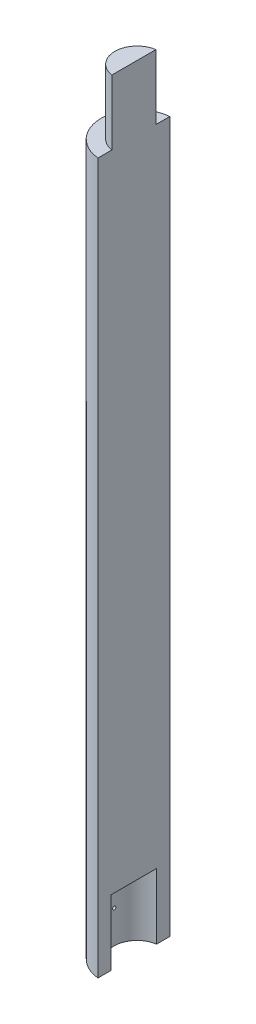
ISO-10303-21;
HEADER;
FILE_DESCRIPTION(('STEP AP214'),'2;1');
FILE_NAME('part.step','',(''),(''),'','','');
FILE_SCHEMA(('AUTOMOTIVE_DESIGN { 1 0 10303 214 1 1 1 1 }'));
ENDSEC;
DATA;
#1=APPLICATION_CONTEXT('core data for automotive mechanical design processes');
#2=APPLICATION_PROTOCOL_DEFINITION('international standard','automotive_design',2000,#1);
#3=PRODUCT_CONTEXT('',#1,'mechanical');
#4=PRODUCT('Part','Part','',(#3));
#5=PRODUCT_RELATED_PRODUCT_CATEGORY('part','',(#4));
#6=PRODUCT_DEFINITION_FORMATION('','',#4);
#7=PRODUCT_DEFINITION_CONTEXT('part definition',#1,'design');
#8=PRODUCT_DEFINITION('design','',#6,#7);
#9=PRODUCT_DEFINITION_SHAPE('','',#8);
#10=(LENGTH_UNIT() NAMED_UNIT(*) SI_UNIT(.MILLI.,.METRE.));
#11=(NAMED_UNIT(*) PLANE_ANGLE_UNIT() SI_UNIT($,.RADIAN.));
#12=(NAMED_UNIT(*) SI_UNIT($,.STERADIAN.) SOLID_ANGLE_UNIT());
#13=UNCERTAINTY_MEASURE_WITH_UNIT(LENGTH_MEASURE(1.E-05),#10,'distance_accuracy_value','');
#14=(GEOMETRIC_REPRESENTATION_CONTEXT(3) GLOBAL_UNCERTAINTY_ASSIGNED_CONTEXT((#13)) GLOBAL_UNIT_ASSIGNED_CONTEXT((#10,
#11,#12)) REPRESENTATION_CONTEXT('',''));
#15=CARTESIAN_POINT('',(0.,0.,0.));
#16=DIRECTION('',(0.,0.,1.));
#17=DIRECTION('',(1.,0.,0.));
#18=AXIS2_PLACEMENT_3D('',#15,#16,#17);
#19=CARTESIAN_POINT('',(0.,216.66667,0.));
#20=DIRECTION('',(0.,-1.,0.));
#21=DIRECTION('',(0.,0.,-1.));
#22=AXIS2_PLACEMENT_3D('',#19,#20,#21);
#23=CYLINDRICAL_SURFACE('',#22,11.);
#24=CARTESIAN_POINT('',(0.,216.66667,0.));
#25=DIRECTION('',(0.,1.,0.));
#26=DIRECTION('',(0.,0.,1.));
#27=AXIS2_PLACEMENT_3D('',#24,#25,#26);
#28=CIRCLE('',#27,11.);
#29=CARTESIAN_POINT('',(-0.999658004225934,216.66667,-10.9544823645203));
#30=VERTEX_POINT('',#29);
#31=CARTESIAN_POINT('',(-0.999658004225934,216.66667,10.9544823645203));
#32=VERTEX_POINT('',#31);
#33=EDGE_CURVE('E133',#30,#32,#28,.T.);
#34=ORIENTED_EDGE('',*,*,#33,.F.);
#35=DIRECTION('',(0.,-1.,0.));
#36=VECTOR('',#35,1.);
#37=CARTESIAN_POINT('',(-0.999658004225934,216.66667,-10.9544823645203));
#38=LINE('',#37,#36);
#39=CARTESIAN_POINT('',(-0.999658004225921,0.,-10.9544823645203));
#40=VERTEX_POINT('',#39);
#41=EDGE_CURVE('E112',#30,#40,#38,.T.);
#42=ORIENTED_EDGE('',*,*,#41,.T.);
#43=CARTESIAN_POINT('',(0.,0.,0.));
#44=DIRECTION('',(0.,1.,0.));
#45=DIRECTION('',(0.,0.,1.));
#46=AXIS2_PLACEMENT_3D('',#43,#44,#45);
#47=CIRCLE('',#46,11.);
#48=CARTESIAN_POINT('',(-0.999658004225921,0.,10.9544823645203));
#49=VERTEX_POINT('',#48);
#50=EDGE_CURVE('E126',#40,#49,#47,.T.);
#51=ORIENTED_EDGE('',*,*,#50,.T.);
#52=DIRECTION('',(0.,-1.,0.));
#53=VECTOR('',#52,1.);
#54=CARTESIAN_POINT('',(-0.999658004225934,216.66667,10.9544823645203));
#55=LINE('',#54,#53);
#56=EDGE_CURVE('E218',#49,#32,#55,.F.);
#57=ORIENTED_EDGE('',*,*,#56,.T.);
#58=EDGE_LOOP('',(#34,#42,#51,#57));
#59=FACE_BOUND('',#58,.T.);
#60=CARTESIAN_POINT('',(-10.988630487918,10.,0.5));
#61=CARTESIAN_POINT('',(-10.9886306408345,10.0280696501689,0.499998760092987));
#62=CARTESIAN_POINT('',(-10.9887391965362,10.0561592841993,0.497628346579886));
#63=CARTESIAN_POINT('',(-10.9891617738135,10.111563880896,0.488205789059037));
#64=CARTESIAN_POINT('',(-10.9894760383788,10.138877887505,0.481148108158415));
#65=CARTESIAN_POINT('',(-10.9902743615562,10.1919206063171,0.462553304914381));
#66=CARTESIAN_POINT('',(-10.9907583345468,10.2176501102539,0.4510184410909));
#67=CARTESIAN_POINT('',(-10.9918414321081,10.2668006100327,0.423800111292425));
#68=CARTESIAN_POINT('',(-10.9924405292368,10.2902221540111,0.408117633643569));
#69=CARTESIAN_POINT('',(-10.9936869605086,10.3341190963652,0.373034082386176));
#70=CARTESIAN_POINT('',(-10.9943343305035,10.3545922712605,0.353630227788665));
#71=CARTESIAN_POINT('',(-10.9956040202434,10.3919923983972,0.311660183260954));
#72=CARTESIAN_POINT('',(-10.9962263389719,10.4089192068511,0.2890938651706));
#73=CARTESIAN_POINT('',(-10.9973760532387,10.4387518304033,0.241428342400779));
#74=CARTESIAN_POINT('',(-10.9979034092951,10.4516559746461,0.216328090940845));
#75=CARTESIAN_POINT('',(-10.9988034158249,10.4730662269478,0.164314589114392));
#76=CARTESIAN_POINT('',(-10.9991760673197,10.4815723640416,0.137401350718222));
#77=CARTESIAN_POINT('',(-10.9997244342223,10.4939394381424,0.0825457433423356));
#78=CARTESIAN_POINT('',(-10.999900286859,10.4978036121525,0.0546041055311855));
#79=CARTESIAN_POINT('',(-11.000035697704,10.5007870571735,-0.00153174798859759));
#80=CARTESIAN_POINT('',(-10.9999952573869,10.499906360536,-0.0297259619738077));
#81=CARTESIAN_POINT('',(-10.9997027557701,10.4934277576983,-0.0855447193423353));
#82=CARTESIAN_POINT('',(-10.9994508508378,10.4878333370489,-0.113169668208691));
#83=CARTESIAN_POINT('',(-10.9987639785037,10.4720914921773,-0.167087931572279));
#84=CARTESIAN_POINT('',(-10.9983290104327,10.4619440513109,-0.193381241201094));
#85=CARTESIAN_POINT('',(-10.9973247459029,10.437380232839,-0.243901084134413));
#86=CARTESIAN_POINT('',(-10.9967553994074,10.4229622645625,-0.268126842985996));
#87=CARTESIAN_POINT('',(-10.9955465079848,10.390267829252,-0.313815434662402));
#88=CARTESIAN_POINT('',(-10.9949069626528,10.3719913399646,-0.335278251551225));
#89=CARTESIAN_POINT('',(-10.9936290272824,10.3320789543008,-0.374852033232831));
#90=CARTESIAN_POINT('',(-10.9929906388124,10.3104400341022,-0.392959948521761));
#91=CARTESIAN_POINT('',(-10.9917875696884,10.2644276690995,-0.425286422576582));
#92=CARTESIAN_POINT('',(-10.9912228890516,10.2400542236578,-0.439504980435741));
#93=CARTESIAN_POINT('',(-10.9902309566139,10.1892628725387,-0.463648844177506));
#94=CARTESIAN_POINT('',(-10.9898037083472,10.1628449143063,-0.473574039654291));
#95=CARTESIAN_POINT('',(-10.9891349587148,10.1087152619428,-0.488847422427505));
#96=CARTESIAN_POINT('',(-10.9888934561942,10.0810035758567,-0.494195638181199));
#97=CARTESIAN_POINT('',(-10.9886236441244,10.0250996558112,-0.500159481912648));
#98=CARTESIAN_POINT('',(-10.9885951439986,9.99690787404632,-0.500779340437574));
#99=CARTESIAN_POINT('',(-10.9887540531531,9.94082068556509,-0.497279910164288));
#100=CARTESIAN_POINT('',(-10.9889414618454,9.9129252780418,-0.493160634272868));
#101=CARTESIAN_POINT('',(-10.9895108909883,9.85823454729661,-0.480303373583729));
#102=CARTESIAN_POINT('',(-10.9898928300031,9.83143876880728,-0.471567321440484));
#103=CARTESIAN_POINT('',(-10.9908082004387,9.77969391621794,-0.44972644894136));
#104=CARTESIAN_POINT('',(-10.9913416325819,9.75474485092288,-0.436621607757152));
#105=CARTESIAN_POINT('',(-10.9925003279132,9.70738216635477,-0.406404284405434));
#106=CARTESIAN_POINT('',(-10.9931256561483,9.68497036309582,-0.389288958344303));
#107=CARTESIAN_POINT('',(-10.9943974300781,9.64333665144888,-0.351540666664192));
#108=CARTESIAN_POINT('',(-10.9950438758858,9.62411476012452,-0.33090768222958));
#109=CARTESIAN_POINT('',(-10.9962855771542,9.58939231959127,-0.286691610802186));
#110=CARTESIAN_POINT('',(-10.9968807948398,9.57389450163491,-0.263106377780339));
#111=CARTESIAN_POINT('',(-10.9979524150765,9.54707880266117,-0.213666176211488));
#112=CARTESIAN_POINT('',(-10.9984288180774,9.53576090581655,-0.18781121625925));
#113=CARTESIAN_POINT('',(-10.999208934329,9.51763110475054,-0.134575685559955));
#114=CARTESIAN_POINT('',(-10.9995127147617,9.51081744738101,-0.107195712885509));
#115=CARTESIAN_POINT('',(-10.9999136148619,9.50188379717436,-0.0516789782946119));
#116=CARTESIAN_POINT('',(-11.0000107354283,9.49976378392577,-0.0235422196697683));
#117=CARTESIAN_POINT('',(-10.9999873742469,9.50027780406042,0.0326622456774278));
#118=CARTESIAN_POINT('',(-10.9998670887664,9.50290754951113,0.0607299917982187));
#119=CARTESIAN_POINT('',(-10.9994228461976,9.51283758381306,0.116025085710192));
#120=CARTESIAN_POINT('',(-10.9990988887193,9.52013788160652,0.143252431892242));
#121=CARTESIAN_POINT('',(-10.9982837606281,9.53920095633928,0.1960948507006));
#122=CARTESIAN_POINT('',(-10.9977925882378,9.55096378071693,0.221709906184275));
#123=CARTESIAN_POINT('',(-10.9966982973532,9.57861717308637,0.270601665911247));
#124=CARTESIAN_POINT('',(-10.996095182461,9.59450760827093,0.293878445355933));
#125=CARTESIAN_POINT('',(-10.9948442968689,9.62998018528402,0.337454128026967));
#126=CARTESIAN_POINT('',(-10.994196491082,9.64956524920548,0.357750651408521));
#127=CARTESIAN_POINT('',(-10.9929294444368,9.69187047620608,0.394773830732596));
#128=CARTESIAN_POINT('',(-10.992310210658,9.71459141076246,0.411499605623786));
#129=CARTESIAN_POINT('',(-10.9911697864303,9.76253883284617,0.440912981719156));
#130=CARTESIAN_POINT('',(-10.9906486821896,9.78776749399876,0.453597038922565));
#131=CARTESIAN_POINT('',(-10.9897646943046,9.83997963401266,0.474534310852451));
#132=CARTESIAN_POINT('',(-10.9894016233843,9.86696099202063,0.482792772787898));
#133=CARTESIAN_POINT('',(-10.9889710270666,9.91175896525654,0.492472130814624));
#134=CARTESIAN_POINT('',(-10.988843885798,9.92928524283079,0.495291491839067));
#135=CARTESIAN_POINT('',(-10.9886735679456,9.96453835458079,0.499055817471611));
#136=CARTESIAN_POINT('',(-10.9886303913031,9.9822651886162,0.500000783391203));
#137=CARTESIAN_POINT('',(-10.988630487918,10.,0.5));
#138=B_SPLINE_CURVE_WITH_KNOTS('',3,(#60,#61,#62,#63,#64,#65,#66,#67,#68,#69,#70,#71,#72,#73,
#74,#75,#76,#77,#78,#79,#80,#81,#82,#83,#84,#85,#86,#87,#88,#89,#90,#91,#92,#93,#94,#95,#96,#97,
#98,#99,#100,#101,#102,#103,#104,#105,#106,#107,#108,#109,#110,#111,#112,#113,#114,#115,#116,
#117,#118,#119,#120,#121,#122,#123,#124,#125,#126,#127,#128,#129,#130,#131,#132,#133,#134,#135,
#136,#137),.UNSPECIFIED.,.T.,.F.,(4,2,2,2,2,2,2,2,2,2,2,2,2,2,2,2,2,2,2,2,2,2,2,2,2,2,2,2,2,2,2,
2,2,2,2,2,2,2,4),(0.,0.0841442128600546,0.168387999329543,0.252589344042456,0.336770642644111,
0.421015096889708,0.505262966164764,0.589545782188115,0.673828041783952,0.758051494234729,
0.842274372434036,0.92643502684802,1.01059598892765,1.09478833849561,1.17898117364354,
1.26325016603962,1.34751917808144,1.43179035701149,1.51606101198364,1.60025625961515,
1.68445127794573,1.76861107881589,1.8527712809261,1.93699134384521,2.02121185726384,
2.10549395115199,2.18977572590329,2.27402467700673,2.35827326173226,2.44244582750093,
2.52661855442661,2.61079217616513,2.69496308992517,2.77920085595452,2.86345938296345,
2.94779159046717,3.03202358697711,3.085187156144,3.13835068811301),.UNSPECIFIED.);
#139=CARTESIAN_POINT('',(-10.988630487918,10.,0.5));
#140=VERTEX_POINT('',#139);
#141=EDGE_CURVE('E175',#140,#140,#138,.T.);
#142=ORIENTED_EDGE('',*,*,#141,.F.);
#143=EDGE_LOOP('',(#142));
#144=FACE_BOUND('',#143,.T.);
#145=ADVANCED_FACE('F45',(#59,#144),#23,.T.);
#146=CARTESIAN_POINT('',(0.,20.,0.));
#147=DIRECTION('',(0.,-1.,0.));
#148=DIRECTION('',(0.,0.,-1.));
#149=AXIS2_PLACEMENT_3D('',#146,#147,#148);
#150=CYLINDRICAL_SURFACE('',#149,7.);
#151=DIRECTION('',(0.,-1.,0.));
#152=VECTOR('',#151,1.);
#153=CARTESIAN_POINT('',(-0.999658004225923,20.,-6.92825258449683));
#154=LINE('',#153,#152);
#155=CARTESIAN_POINT('',(-0.999658004225923,20.,-6.92825258449683));
#156=VERTEX_POINT('',#155);
#157=CARTESIAN_POINT('',(-0.999658004225921,0.,-6.92825258449683));
#158=VERTEX_POINT('',#157);
#159=EDGE_CURVE('E215',#156,#158,#154,.T.);
#160=ORIENTED_EDGE('',*,*,#159,.F.);
#161=CARTESIAN_POINT('',(0.,20.,0.));
#162=DIRECTION('',(0.,1.,0.));
#163=DIRECTION('',(0.,0.,1.));
#164=AXIS2_PLACEMENT_3D('',#161,#162,#163);
#165=CIRCLE('',#164,7.);
#166=CARTESIAN_POINT('',(-0.999658004225923,20.,6.92825258449683));
#167=VERTEX_POINT('',#166);
#168=EDGE_CURVE('E178',#156,#167,#165,.T.);
#169=ORIENTED_EDGE('',*,*,#168,.T.);
#170=DIRECTION('',(0.,-1.,0.));
#171=VECTOR('',#170,1.);
#172=CARTESIAN_POINT('',(-0.999658004225923,20.,6.92825258449683));
#173=LINE('',#172,#171);
#174=CARTESIAN_POINT('',(-0.999658004225921,0.,6.92825258449683));
#175=VERTEX_POINT('',#174);
#176=EDGE_CURVE('E61',#175,#167,#173,.F.);
#177=ORIENTED_EDGE('',*,*,#176,.F.);
#178=CARTESIAN_POINT('',(0.,0.,0.));
#179=DIRECTION('',(0.,1.,0.));
#180=DIRECTION('',(0.,0.,1.));
#181=AXIS2_PLACEMENT_3D('',#178,#179,#180);
#182=CIRCLE('',#181,7.);
#183=EDGE_CURVE('E54',#175,#158,#182,.F.);
#184=ORIENTED_EDGE('',*,*,#183,.T.);
#185=EDGE_LOOP('',(#160,#169,#177,#184));
#186=FACE_BOUND('',#185,.T.);
#187=CARTESIAN_POINT('',(-6.98212002188447,10.,0.5));
#188=CARTESIAN_POINT('',(-6.98212026019684,10.0280467568763,0.499998769244178));
#189=CARTESIAN_POINT('',(-6.98229083321164,10.0561129379612,0.497632204535513));
#190=CARTESIAN_POINT('',(-6.98295474085973,10.111469702785,0.488225828593486));
#191=CARTESIAN_POINT('',(-6.98344844724258,10.1387593553861,0.481180634683073));
#192=CARTESIAN_POINT('',(-6.98470241732412,10.1917532394701,0.462620946811939));
#193=CARTESIAN_POINT('',(-6.98546253619947,10.217458323424,0.451108880704623));
#194=CARTESIAN_POINT('',(-6.98716350167581,10.266564810098,0.42394632109158));
#195=CARTESIAN_POINT('',(-6.98810430796363,10.2899667249199,0.40829675041145));
#196=CARTESIAN_POINT('',(-6.99006267981786,10.3338540367072,0.373270687165762));
#197=CARTESIAN_POINT('',(-6.99108037313231,10.3543344089305,0.353887905249338));
#198=CARTESIAN_POINT('',(-6.99307666982089,10.3917541926016,0.311958772798071));
#199=CARTESIAN_POINT('',(-6.99405527153302,10.4086934536265,0.289412287940214));
#200=CARTESIAN_POINT('',(-6.99586427570959,10.438566211619,0.241766646581247));
#201=CARTESIAN_POINT('',(-6.99669452070996,10.4514954629885,0.216664821695315));
#202=CARTESIAN_POINT('',(-6.9981119033184,10.472954019596,0.164639720829318));
#203=CARTESIAN_POINT('',(-6.99869904417823,10.4814833836872,0.137716469218328));
#204=CARTESIAN_POINT('',(-6.99956317551645,10.4938858643815,0.0828619346968116));
#205=CARTESIAN_POINT('',(-6.99984069832454,10.4977669736276,0.054932467421988));
#206=CARTESIAN_POINT('',(-7.00005612169472,10.5007874671409,-0.00118278070601036));
#207=CARTESIAN_POINT('',(-6.99999402706535,10.4999269185439,-0.0293685579245249));
#208=CARTESIAN_POINT('',(-6.99953765415375,10.4934950936711,-0.0851421760802396));
#209=CARTESIAN_POINT('',(-6.99914398205092,10.4879324136158,-0.112731013983813));
#210=CARTESIAN_POINT('',(-6.99806945593314,10.4722675803337,-0.166582379213727));
#211=CARTESIAN_POINT('',(-6.99738859980816,10.4621653937534,-0.192844896793534));
#212=CARTESIAN_POINT('',(-6.99581529622793,10.4376986375456,-0.243325627021074));
#213=CARTESIAN_POINT('',(-6.99492265643054,10.4233301902953,-0.267541954044169));
#214=CARTESIAN_POINT('',(-6.99302618810151,10.3907415982159,-0.313222303766978));
#215=CARTESIAN_POINT('',(-6.99202235792308,10.3725213963366,-0.334686285692684));
#216=CARTESIAN_POINT('',(-6.99001377364571,10.3326979895382,-0.374302869122249));
#217=CARTESIAN_POINT('',(-6.98900902249019,10.311087320156,-0.392447968185296));
#218=CARTESIAN_POINT('',(-6.98711410889444,10.2651225225752,-0.42485382255042));
#219=CARTESIAN_POINT('',(-6.9862239465164,10.2407683928878,-0.439114575744563));
#220=CARTESIAN_POINT('',(-6.98465877511779,10.1900030332037,-0.463346491817702));
#221=CARTESIAN_POINT('',(-6.98398378339497,10.163591638034,-0.473317309847772));
#222=CARTESIAN_POINT('',(-6.98292565515787,10.1094637840781,-0.488680993922061));
#223=CARTESIAN_POINT('',(-6.98254251415107,10.0817473453878,-0.494073930434823));
#224=CARTESIAN_POINT('',(-6.98211214327375,10.0258616959009,-0.500119359653543));
#225=CARTESIAN_POINT('',(-6.98206417348304,9.99769362011582,-0.500782294326562));
#226=CARTESIAN_POINT('',(-6.9823076204162,9.94164669874765,-0.497376211665614));
#227=CARTESIAN_POINT('',(-6.98259903482474,9.91376785119272,-0.493307226613501));
#228=CARTESIAN_POINT('',(-6.98348773690515,9.8591204685044,-0.480561494259024));
#229=CARTESIAN_POINT('',(-6.98408470364616,9.83235080019215,-0.47188958119827));
#230=CARTESIAN_POINT('',(-6.98551697215986,9.78064664207959,-0.450189059868942));
#231=CARTESIAN_POINT('',(-6.98635227675284,9.7557121739999,-0.437160400045965));
#232=CARTESIAN_POINT('',(-6.98816889099223,9.70833832047326,-0.407089639890386));
#233=CARTESIAN_POINT('',(-6.98915045351666,9.68590337647051,-0.390040557953417));
#234=CARTESIAN_POINT('',(-6.9911481055053,9.64421021613506,-0.35242304464853));
#235=CARTESIAN_POINT('',(-6.99216419540784,9.62495204015023,-0.331854568587816));
#236=CARTESIAN_POINT('',(-6.99411858955844,9.59012366709107,-0.287737117260083));
#237=CARTESIAN_POINT('',(-6.99505674904584,9.57456023786159,-0.264182791853267));
#238=CARTESIAN_POINT('',(-6.99674749336386,9.54760950654519,-0.214789067826832));
#239=CARTESIAN_POINT('',(-6.99750007962143,9.53622217234633,-0.188949686779959));
#240=CARTESIAN_POINT('',(-6.99873420077067,9.51795858984637,-0.135743969017849));
#241=CARTESIAN_POINT('',(-6.99921599063627,9.51107809702254,-0.108379095443336));
#242=CARTESIAN_POINT('',(-6.99985525867364,9.5020096256133,-0.0528789486615824));
#243=CARTESIAN_POINT('',(-7.00001274119515,9.4998215840907,-0.0247436857922632));
#244=CARTESIAN_POINT('',(-6.99998566144827,9.5002007790722,0.031431710301488));
#245=CARTESIAN_POINT('',(-6.99980185973598,9.50275744193737,0.0594719158770192));
#246=CARTESIAN_POINT('',(-6.99911437947149,9.51253149774485,0.114723743333768));
#247=CARTESIAN_POINT('',(-6.99861070040063,9.51974889824412,0.141935363871435));
#248=CARTESIAN_POINT('',(-6.99734003711329,9.53863703700059,0.194758789707946));
#249=CARTESIAN_POINT('',(-6.99657305920753,9.55030766852392,0.220370633332701));
#250=CARTESIAN_POINT('',(-6.99486179076899,9.57776965097329,0.269272950537146));
#251=CARTESIAN_POINT('',(-6.99391750412449,9.59356091153917,0.292563475004946));
#252=CARTESIAN_POINT('',(-6.99195524198601,9.62885535141929,0.336215926305171));
#253=CARTESIAN_POINT('',(-6.99093711557054,9.64836627386057,0.356571585645878));
#254=CARTESIAN_POINT('',(-6.98894317771428,9.69053387438338,0.393726345843105));
#255=CARTESIAN_POINT('',(-6.98796737664557,9.71319131788803,0.410524578801508));
#256=CARTESIAN_POINT('',(-6.98616697590803,9.76104171541481,0.440104070755859));
#257=CARTESIAN_POINT('',(-6.98534260310901,9.78623838765043,0.452879322648844));
#258=CARTESIAN_POINT('',(-6.98394123735022,9.83840709413575,0.474002001315433));
#259=CARTESIAN_POINT('',(-6.98336395689531,9.86537702277909,0.48235457662887));
#260=CARTESIAN_POINT('',(-6.98267232186361,9.91042474111922,0.492240993453022));
#261=CARTESIAN_POINT('',(-6.98246614527858,9.92821188959728,0.495146817248094));
#262=CARTESIAN_POINT('',(-6.98218991892011,9.96399669043415,0.499026713772105));
#263=CARTESIAN_POINT('',(-6.98211986889099,9.98199434239751,0.500000790129427));
#264=CARTESIAN_POINT('',(-6.98212002188447,10.,0.5));
#265=B_SPLINE_CURVE_WITH_KNOTS('',3,(#187,#188,#189,#190,#191,#192,#193,#194,#195,#196,#197,
#198,#199,#200,#201,#202,#203,#204,#205,#206,#207,#208,#209,#210,#211,#212,#213,#214,#215,#216,
#217,#218,#219,#220,#221,#222,#223,#224,#225,#226,#227,#228,#229,#230,#231,#232,#233,#234,#235,
#236,#237,#238,#239,#240,#241,#242,#243,#244,#245,#246,#247,#248,#249,#250,#251,#252,#253,#254,
#255,#256,#257,#258,#259,#260,#261,#262,#263,#264),.UNSPECIFIED.,.T.,.F.,(4,2,2,2,2,2,2,2,2,2,2,
2,2,2,2,2,2,2,2,2,2,2,2,2,2,2,2,2,2,2,2,2,2,2,2,2,2,2,4),(0.,0.0840745348681494,
0.168245963905642,0.252371707669572,0.336478703903151,0.420728654807236,0.504982183839144,
0.589324614168667,0.673665916294283,0.757861984941225,0.842056861483251,0.926098148884886,
1.01014005377849,1.09425857977757,1.17837835178802,1.26268599047371,1.34699367491084,
1.43130813520442,1.51562129759961,1.59974827223689,1.68387467295091,1.76791289392929,
1.85195210938678,1.93613835076696,2.02032566130781,2.10466601202528,2.18900571419723,
2.27326587097592,2.35752489761365,2.44159637729523,2.52566799329151,2.60973759440808,
2.69380535213984,2.77805006119128,2.8623152996366,2.94670577250915,3.03099778728952,
3.08497265996376,3.13894743125739),.UNSPECIFIED.);
#266=CARTESIAN_POINT('',(-6.98212002188447,10.,0.5));
#267=VERTEX_POINT('',#266);
#268=EDGE_CURVE('E179',#267,#267,#265,.T.);
#269=ORIENTED_EDGE('',*,*,#268,.T.);
#270=EDGE_LOOP('',(#269));
#271=FACE_BOUND('',#270,.T.);
#272=ADVANCED_FACE('F164',(#186,#271),#150,.F.);
#273=CARTESIAN_POINT('',(0.,216.66667,0.));
#274=DIRECTION('',(0.,1.,0.));
#275=DIRECTION('',(0.,0.,1.));
#276=AXIS2_PLACEMENT_3D('',#273,#274,#275);
#277=PLANE('',#276);
#278=DIRECTION('',(0.,0.,1.));
#279=VECTOR('',#278,1.);
#280=CARTESIAN_POINT('',(-0.999658004225934,216.66667,-11.));
#281=LINE('',#280,#279);
#282=CARTESIAN_POINT('',(-0.999658004225934,216.66667,-6.72611952574343));
#283=VERTEX_POINT('',#282);
#284=EDGE_CURVE('E109',#30,#283,#281,.T.);
#285=ORIENTED_EDGE('',*,*,#284,.F.);
#286=ORIENTED_EDGE('',*,*,#33,.T.);
#287=CARTESIAN_POINT('',(-0.999658004225934,216.66667,6.72611952574343));
#288=VERTEX_POINT('',#287);
#289=EDGE_CURVE('E105',#288,#32,#281,.T.);
#290=ORIENTED_EDGE('',*,*,#289,.F.);
#291=CARTESIAN_POINT('',(0.,216.66667,0.));
#292=DIRECTION('',(0.,1.,0.));
#293=DIRECTION('',(0.,0.,1.));
#294=AXIS2_PLACEMENT_3D('',#291,#292,#293);
#295=CIRCLE('',#294,6.8);
#296=EDGE_CURVE('E100',#283,#288,#295,.T.);
#297=ORIENTED_EDGE('',*,*,#296,.F.);
#298=EDGE_LOOP('',(#285,#286,#290,#297));
#299=FACE_BOUND('',#298,.T.);
#300=ADVANCED_FACE('F120',(#299),#277,.T.);
#301=CARTESIAN_POINT('',(0.,0.,0.));
#302=DIRECTION('',(0.,1.,0.));
#303=DIRECTION('',(0.,0.,1.));
#304=AXIS2_PLACEMENT_3D('',#301,#302,#303);
#305=PLANE('',#304);
#306=ORIENTED_EDGE('',*,*,#50,.F.);
#307=DIRECTION('',(0.,0.,1.));
#308=VECTOR('',#307,1.);
#309=CARTESIAN_POINT('',(-0.999658004225921,0.,-11.));
#310=LINE('',#309,#308);
#311=EDGE_CURVE('E222',#40,#158,#310,.T.);
#312=ORIENTED_EDGE('',*,*,#311,.T.);
#313=ORIENTED_EDGE('',*,*,#183,.F.);
#314=EDGE_CURVE('E117',#175,#49,#310,.T.);
#315=ORIENTED_EDGE('',*,*,#314,.T.);
#316=EDGE_LOOP('',(#306,#312,#313,#315));
#317=FACE_BOUND('',#316,.T.);
#318=ADVANCED_FACE('F161',(#317),#305,.F.);
#319=CARTESIAN_POINT('',(0.,236.46667,0.));
#320=DIRECTION('',(0.,-1.,0.));
#321=DIRECTION('',(0.,0.,-1.));
#322=AXIS2_PLACEMENT_3D('',#319,#320,#321);
#323=CYLINDRICAL_SURFACE('',#322,6.8);
#324=CARTESIAN_POINT('',(-6.78159273327439,226.66667,-0.500000000000003));
#325=CARTESIAN_POINT('',(-6.78159297837757,226.6947144594,-0.499998770231773));
#326=CARTESIAN_POINT('',(-6.78176856677654,226.722778286839,-0.497632591546759));
#327=CARTESIAN_POINT('',(-6.78245198649018,226.778130251371,-0.488227838713539));
#328=CARTESIAN_POINT('',(-6.78296019944658,226.805417459827,-0.481183897328644));
#329=CARTESIAN_POINT('',(-6.78425099555627,226.858406442766,-0.462627731505162));
#330=CARTESIAN_POINT('',(-6.78503342856656,226.884109075812,-0.45111795186696));
#331=CARTESIAN_POINT('',(-6.78678431460583,226.933211144203,-0.423960985491659));
#332=CARTESIAN_POINT('',(-6.78775272642473,226.956611088056,-0.408314715049562));
#333=CARTESIAN_POINT('',(-6.78976866583827,227.000497428313,-0.373294420232593));
#334=CARTESIAN_POINT('',(-6.79081633232312,227.020978519599,-0.353913755066674));
#335=CARTESIAN_POINT('',(-6.79287145399055,227.058400269882,-0.311988733735704));
#336=CARTESIAN_POINT('',(-6.79387890745549,227.075340777778,-0.289444242616633));
#337=CARTESIAN_POINT('',(-6.79574135636166,227.105217562981,-0.241800601139886));
#338=CARTESIAN_POINT('',(-6.79659617984393,227.118149335811,-0.216698618778854));
#339=CARTESIAN_POINT('',(-6.79805556933641,227.139612743824,-0.164672353745901));
#340=CARTESIAN_POINT('',(-6.79866013886455,227.148144440863,-0.137748096696646));
#341=CARTESIAN_POINT('',(-6.79954993521933,227.160550477922,-0.0828936605519977));
#342=CARTESIAN_POINT('',(-6.79983574266283,227.164433286724,-0.0549654063471341));
#343=CARTESIAN_POINT('',(-6.80005777399104,227.167457495318,0.00114779135176697));
#344=CARTESIAN_POINT('',(-6.79999400308205,227.166598965722,0.0293327310167222));
#345=CARTESIAN_POINT('',(-6.79952454466821,227.160171822787,0.0851018411694216));
#346=CARTESIAN_POINT('',(-6.79911951834028,227.154612317439,0.112687067651171));
#347=CARTESIAN_POINT('',(-6.79801388751421,227.138955185032,0.166531741703012));
#348=CARTESIAN_POINT('',(-6.79731328073735,227.128857522987,0.192791179050389));
#349=CARTESIAN_POINT('',(-6.79569420149225,227.104400479208,0.243267979866799));
#350=CARTESIAN_POINT('',(-6.79477551941266,227.09003699386,0.267483348055107));
#351=CARTESIAN_POINT('',(-6.79282360632603,227.057459011694,0.313162842512627));
#352=CARTESIAN_POINT('',(-6.79179037351871,227.039244454349,0.334626925531555));
#353=CARTESIAN_POINT('',(-6.78972267451368,226.999429985177,0.374247769142871));
#354=CARTESIAN_POINT('',(-6.78868821118392,226.977822163606,0.392396582431207));
#355=CARTESIAN_POINT('',(-6.78673711523689,226.931862171376,0.424810372711896));
#356=CARTESIAN_POINT('',(-6.78582048268846,226.907509999112,0.43907534743491));
#357=CARTESIAN_POINT('',(-6.78420861400634,226.856747260943,0.463316094783634));
#358=CARTESIAN_POINT('',(-6.78351339713152,226.83033651623,0.473291494325563));
#359=CARTESIAN_POINT('',(-6.78242339907657,226.776208823244,0.488664243993162));
#360=CARTESIAN_POINT('',(-6.7820286129932,226.748491896297,0.494061668834622));
#361=CARTESIAN_POINT('',(-6.78158492474778,226.692608051427,0.500115276160827));
#362=CARTESIAN_POINT('',(-6.78153521539852,226.664442338217,0.500782523331512));
#363=CARTESIAN_POINT('',(-6.78178517593299,226.60839942571,0.497385780829759));
#364=CARTESIAN_POINT('',(-6.78208484328886,226.580522224328,0.493321825389036));
#365=CARTESIAN_POINT('',(-6.78299905331064,226.525879190008,0.480587245964444));
#366=CARTESIAN_POINT('',(-6.78361324534929,226.499112155315,0.471921751308704));
#367=CARTESIAN_POINT('',(-6.78508700233736,226.447412112612,0.450235279473719));
#368=CARTESIAN_POINT('',(-6.78594657036215,226.422479127592,0.437214247704794));
#369=CARTESIAN_POINT('',(-6.78781617977533,226.375104209245,0.407158182314458));
#370=CARTESIAN_POINT('',(-6.78882649706358,226.35266697787,0.390115754806744));
#371=CARTESIAN_POINT('',(-6.79088281220847,226.310967920048,0.352511390028029));
#372=CARTESIAN_POINT('',(-6.79192881054459,226.291706136291,0.331949405448091));
#373=CARTESIAN_POINT('',(-6.79394100886642,226.256867175691,0.287841888640223));
#374=CARTESIAN_POINT('',(-6.79490705113871,226.241297173206,0.264290681464511));
#375=CARTESIAN_POINT('',(-6.79664822050773,226.214332907777,0.214901657852376));
#376=CARTESIAN_POINT('',(-6.79742334914581,226.202938611121,0.189063859879152));
#377=CARTESIAN_POINT('',(-6.7986946168929,226.184661601532,0.135861139830734));
#378=CARTESIAN_POINT('',(-6.79919103352641,226.177774399572,0.108497766791575));
#379=CARTESIAN_POINT('',(-6.7998500618275,226.168692400326,0.0529992515100641));
#380=CARTESIAN_POINT('',(-6.80001267827624,226.16649753583,0.0248641203277486));
#381=CARTESIAN_POINT('',(-6.79998579508498,226.166863226587,-0.0313083985646522));
#382=CARTESIAN_POINT('',(-6.79979712504935,226.169412577808,-0.059345860296129));
#383=CARTESIAN_POINT('',(-6.79909051843197,226.179171036077,-0.114593381986072));
#384=CARTESIAN_POINT('',(-6.79857258132922,226.1863801505,-0.141803440635282));
#385=CARTESIAN_POINT('',(-6.79726560326606,226.205250795847,-0.194624944412667));
#386=CARTESIAN_POINT('',(-6.79647657014824,226.216912197971,-0.220236435760865));
#387=CARTESIAN_POINT('',(-6.79471583354579,226.244355010418,-0.269139744831946));
#388=CARTESIAN_POINT('',(-6.79374413388129,226.260136334581,-0.292431611050076));
#389=CARTESIAN_POINT('',(-6.79172451801548,226.295412890635,-0.336091669932223));
#390=CARTESIAN_POINT('',(-6.7906764362776,226.314916346633,-0.356453209880313));
#391=CARTESIAN_POINT('',(-6.78862356662167,226.357070065518,-0.393621074326443));
#392=CARTESIAN_POINT('',(-6.78761878930475,226.379721093277,-0.410426532172276));
#393=CARTESIAN_POINT('',(-6.78576458384905,226.42756169053,-0.440022648082056));
#394=CARTESIAN_POINT('',(-6.78491539882182,226.452755138886,-0.452807045234638));
#395=CARTESIAN_POINT('',(-6.78347155374233,226.504919460085,-0.473948321363642));
#396=CARTESIAN_POINT('',(-6.78287659844061,226.531888228904,-0.482310338964581));
#397=CARTESIAN_POINT('',(-6.78216306649953,226.576960950742,-0.492217618601718));
#398=CARTESIAN_POINT('',(-6.78195016075426,226.594774246929,-0.495132185938419));
#399=CARTESIAN_POINT('',(-6.78166491548103,226.630612359725,-0.499023770068944));
#400=CARTESIAN_POINT('',(-6.78159257567097,226.648637175909,-0.500000790751353));
#401=CARTESIAN_POINT('',(-6.78159273327439,226.66667,-0.500000000000003));
#402=B_SPLINE_CURVE_WITH_KNOTS('',3,(#324,#325,#326,#327,#328,#329,#330,#331,#332,#333,#334,
#335,#336,#337,#338,#339,#340,#341,#342,#343,#344,#345,#346,#347,#348,#349,#350,#351,#352,#353,
#354,#355,#356,#357,#358,#359,#360,#361,#362,#363,#364,#365,#366,#367,#368,#369,#370,#371,#372,
#373,#374,#375,#376,#377,#378,#379,#380,#381,#382,#383,#384,#385,#386,#387,#388,#389,#390,#391,
#392,#393,#394,#395,#396,#397,#398,#399,#400,#401),.UNSPECIFIED.,.T.,.F.,(4,2,2,2,2,2,2,2,2,2,2,
2,2,2,2,2,2,2,2,2,2,2,2,2,2,2,2,2,2,2,2,2,2,2,2,2,2,2,4),(0.,0.084067542244147,
0.168231710124494,0.25234986762154,0.33644940726993,0.420699902967313,0.50495399348977,
0.589302417128914,0.673649655006859,0.757843004383307,0.842035099863553,0.9260644486161,
1.01009444519175,1.09420553978808,1.17831795645116,1.26262943303786,1.34694095888795,
1.43125981621085,1.51557729736375,1.59969748038507,1.68381705477462,1.7678430574443,
1.85187011328479,1.93605288503218,2.02023678843055,2.10458297232425,2.18892847522237,
2.27318984236082,2.35745000258294,2.44151142487004,2.52557298016638,2.60963210383002,
2.69368946974239,2.77793475820918,2.86220055449528,2.94659691296704,3.03089498965295,
3.08495123733824,3.13900737653456),.UNSPECIFIED.);
#403=CARTESIAN_POINT('',(-6.78159273327439,226.66667,-0.500000000000003));
#404=VERTEX_POINT('',#403);
#405=EDGE_CURVE('E122',#404,#404,#402,.T.);
#406=ORIENTED_EDGE('',*,*,#405,.T.);
#407=EDGE_LOOP('',(#406));
#408=FACE_BOUND('',#407,.T.);
#409=CARTESIAN_POINT('',(0.,236.46667,0.));
#410=DIRECTION('',(0.,1.,0.));
#411=DIRECTION('',(0.,0.,1.));
#412=AXIS2_PLACEMENT_3D('',#409,#410,#411);
#413=CIRCLE('',#412,6.8);
#414=CARTESIAN_POINT('',(-0.999658004225938,236.46667,-6.72611952574343));
#415=VERTEX_POINT('',#414);
#416=CARTESIAN_POINT('',(-0.999658004225938,236.46667,6.72611952574343));
#417=VERTEX_POINT('',#416);
#418=EDGE_CURVE('E102',#415,#417,#413,.T.);
#419=ORIENTED_EDGE('',*,*,#418,.F.);
#420=DIRECTION('',(0.,-1.,0.));
#421=VECTOR('',#420,1.);
#422=CARTESIAN_POINT('',(-0.999658004225938,236.46667,-6.72611952574343));
#423=LINE('',#422,#421);
#424=EDGE_CURVE('E95',#415,#283,#423,.T.);
#425=ORIENTED_EDGE('',*,*,#424,.T.);
#426=ORIENTED_EDGE('',*,*,#296,.T.);
#427=DIRECTION('',(0.,-1.,0.));
#428=VECTOR('',#427,1.);
#429=CARTESIAN_POINT('',(-0.999658004225938,236.46667,6.72611952574343));
#430=LINE('',#429,#428);
#431=EDGE_CURVE('E106',#288,#417,#430,.F.);
#432=ORIENTED_EDGE('',*,*,#431,.T.);
#433=EDGE_LOOP('',(#419,#425,#426,#432));
#434=FACE_BOUND('',#433,.T.);
#435=ADVANCED_FACE('F97',(#408,#434),#323,.T.);
#436=CARTESIAN_POINT('',(0.,236.46667,0.));
#437=DIRECTION('',(0.,1.,0.));
#438=DIRECTION('',(0.,0.,1.));
#439=AXIS2_PLACEMENT_3D('',#436,#437,#438);
#440=PLANE('',#439);
#441=DIRECTION('',(0.,0.,1.));
#442=VECTOR('',#441,1.);
#443=CARTESIAN_POINT('',(-0.999658004225938,236.46667,0.));
#444=LINE('',#443,#442);
#445=EDGE_CURVE('E231',#415,#417,#444,.T.);
#446=ORIENTED_EDGE('',*,*,#445,.F.);
#447=ORIENTED_EDGE('',*,*,#418,.T.);
#448=EDGE_LOOP('',(#446,#447));
#449=FACE_BOUND('',#448,.T.);
#450=ADVANCED_FACE('F152',(#449),#440,.T.);
#451=CARTESIAN_POINT('',(-10.4,226.66667,0.));
#452=DIRECTION('',(1.,0.,0.));
#453=DIRECTION('',(0.,0.,-1.));
#454=AXIS2_PLACEMENT_3D('',#451,#452,#453);
#455=CYLINDRICAL_SURFACE('',#454,0.500000000000003);
#456=CARTESIAN_POINT('',(-1.4,226.66667,0.));
#457=DIRECTION('',(1.,0.,0.));
#458=DIRECTION('',(0.,0.,-1.));
#459=AXIS2_PLACEMENT_3D('',#456,#457,#458);
#460=CIRCLE('',#459,0.500000000000003);
#461=CARTESIAN_POINT('',(-1.4,226.66667,-0.500000000000003));
#462=VERTEX_POINT('',#461);
#463=EDGE_CURVE('E129',#462,#462,#460,.T.);
#464=ORIENTED_EDGE('',*,*,#463,.T.);
#465=EDGE_LOOP('',(#464));
#466=FACE_BOUND('',#465,.T.);
#467=ORIENTED_EDGE('',*,*,#405,.F.);
#468=EDGE_LOOP('',(#467));
#469=FACE_BOUND('',#468,.T.);
#470=ADVANCED_FACE('F147',(#466,#469),#455,.F.);
#471=CARTESIAN_POINT('',(-1.4,226.66667,0.));
#472=DIRECTION('',(1.,0.,0.));
#473=DIRECTION('',(0.,0.,-1.));
#474=AXIS2_PLACEMENT_3D('',#471,#472,#473);
#475=PLANE('',#474);
#476=ORIENTED_EDGE('',*,*,#463,.F.);
#477=EDGE_LOOP('',(#476));
#478=FACE_BOUND('',#477,.T.);
#479=ADVANCED_FACE('F151',(#478),#475,.F.);
#480=CARTESIAN_POINT('',(0.,20.,0.));
#481=DIRECTION('',(0.,1.,0.));
#482=DIRECTION('',(0.,0.,1.));
#483=AXIS2_PLACEMENT_3D('',#480,#481,#482);
#484=PLANE('',#483);
#485=ORIENTED_EDGE('',*,*,#168,.F.);
#486=DIRECTION('',(0.,0.,1.));
#487=VECTOR('',#486,1.);
#488=CARTESIAN_POINT('',(-0.999658004225923,20.,0.));
#489=LINE('',#488,#487);
#490=EDGE_CURVE('E11',#156,#167,#489,.T.);
#491=ORIENTED_EDGE('',*,*,#490,.T.);
#492=EDGE_LOOP('',(#485,#491));
#493=FACE_BOUND('',#492,.T.);
#494=ADVANCED_FACE('F196',(#493),#484,.F.);
#495=CARTESIAN_POINT('',(1.2E-05,10.,0.));
#496=DIRECTION('',(-1.,0.,0.));
#497=DIRECTION('',(0.,0.,1.));
#498=AXIS2_PLACEMENT_3D('',#495,#496,#497);
#499=CYLINDRICAL_SURFACE('',#498,0.5);
#500=ORIENTED_EDGE('',*,*,#268,.F.);
#501=EDGE_LOOP('',(#500));
#502=FACE_BOUND('',#501,.T.);
#503=ORIENTED_EDGE('',*,*,#141,.T.);
#504=EDGE_LOOP('',(#503));
#505=FACE_BOUND('',#504,.T.);
#506=ADVANCED_FACE('F192',(#502,#505),#499,.F.);
#507=CARTESIAN_POINT('',(-0.999658004225934,216.66667,-11.));
#508=DIRECTION('',(-1.,0.,0.));
#509=DIRECTION('',(0.,-1.,0.));
#510=AXIS2_PLACEMENT_3D('',#507,#508,#509);
#511=PLANE('',#510);
#512=ORIENTED_EDGE('',*,*,#284,.T.);
#513=ORIENTED_EDGE('',*,*,#424,.F.);
#514=ORIENTED_EDGE('',*,*,#445,.T.);
#515=ORIENTED_EDGE('',*,*,#431,.F.);
#516=ORIENTED_EDGE('',*,*,#289,.T.);
#517=ORIENTED_EDGE('',*,*,#56,.F.);
#518=ORIENTED_EDGE('',*,*,#314,.F.);
#519=ORIENTED_EDGE('',*,*,#176,.T.);
#520=ORIENTED_EDGE('',*,*,#490,.F.);
#521=ORIENTED_EDGE('',*,*,#159,.T.);
#522=ORIENTED_EDGE('',*,*,#311,.F.);
#523=ORIENTED_EDGE('',*,*,#41,.F.);
#524=EDGE_LOOP('',(#512,#513,#514,#515,#516,#517,#518,#519,#520,#521,#522,#523));
#525=FACE_BOUND('',#524,.T.);
#526=ADVANCED_FACE('F110',(#525),#511,.F.);
#527=CLOSED_SHELL('',(#145,#272,#300,#318,#435,#450,#470,#479,#494,#506,#526));
#528=MANIFOLD_SOLID_BREP('B2',#527);
#529=ADVANCED_BREP_SHAPE_REPRESENTATION('',(#18,#528),#14);
#530=SHAPE_DEFINITION_REPRESENTATION(#9,#529);
ENDSEC;
END-ISO-10303-21;
